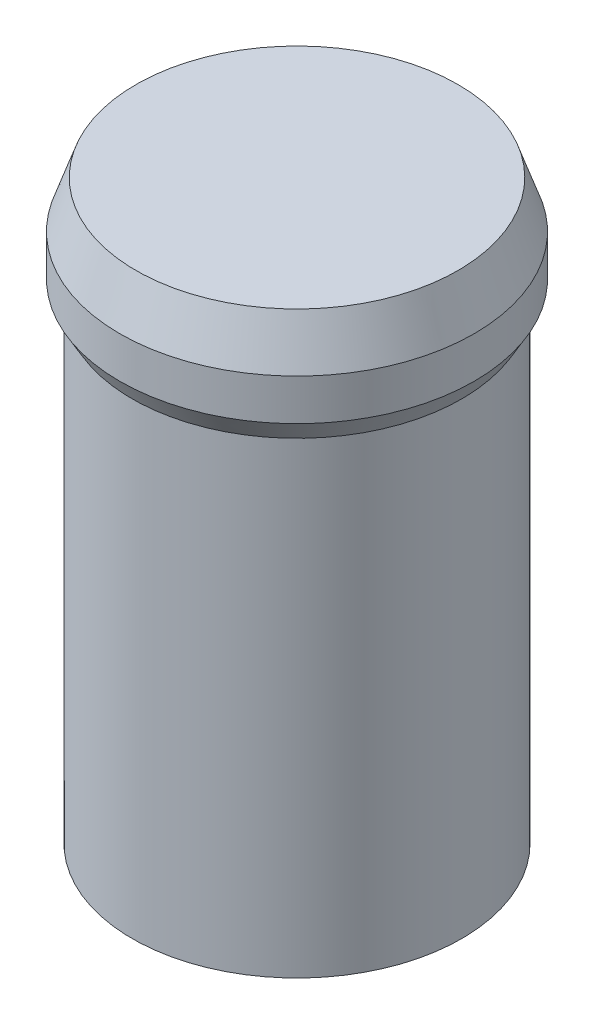
ISO-10303-21;
HEADER;
FILE_DESCRIPTION(('STEP AP214'),'2;1');
FILE_NAME('part.step','',(''),(''),'','','');
FILE_SCHEMA(('AUTOMOTIVE_DESIGN { 1 0 10303 214 1 1 1 1 }'));
ENDSEC;
DATA;
#1=APPLICATION_CONTEXT('core data for automotive mechanical design processes');
#2=APPLICATION_PROTOCOL_DEFINITION('international standard','automotive_design',2000,#1);
#3=PRODUCT_CONTEXT('',#1,'mechanical');
#4=PRODUCT('Part','Part','',(#3));
#5=PRODUCT_RELATED_PRODUCT_CATEGORY('part','',(#4));
#6=PRODUCT_DEFINITION_FORMATION('','',#4);
#7=PRODUCT_DEFINITION_CONTEXT('part definition',#1,'design');
#8=PRODUCT_DEFINITION('design','',#6,#7);
#9=PRODUCT_DEFINITION_SHAPE('','',#8);
#10=(LENGTH_UNIT() NAMED_UNIT(*) SI_UNIT(.MILLI.,.METRE.));
#11=(NAMED_UNIT(*) PLANE_ANGLE_UNIT() SI_UNIT($,.RADIAN.));
#12=(NAMED_UNIT(*) SI_UNIT($,.STERADIAN.) SOLID_ANGLE_UNIT());
#13=UNCERTAINTY_MEASURE_WITH_UNIT(LENGTH_MEASURE(1.E-05),#10,'distance_accuracy_value','');
#14=(GEOMETRIC_REPRESENTATION_CONTEXT(3) GLOBAL_UNCERTAINTY_ASSIGNED_CONTEXT((#13)) GLOBAL_UNIT_ASSIGNED_CONTEXT((#10,
#11,#12)) REPRESENTATION_CONTEXT('',''));
#15=CARTESIAN_POINT('',(0.,0.,0.));
#16=DIRECTION('',(0.,0.,1.));
#17=DIRECTION('',(1.,0.,0.));
#18=AXIS2_PLACEMENT_3D('',#15,#16,#17);
#19=CARTESIAN_POINT('',(20.,0.,0.));
#20=DIRECTION('',(0.,-1.,0.));
#21=DIRECTION('',(0.,0.,-1.));
#22=AXIS2_PLACEMENT_3D('',#19,#20,#21);
#23=PLANE('',#22);
#24=CARTESIAN_POINT('',(0.,0.,0.));
#25=DIRECTION('',(0.,-1.,0.));
#26=DIRECTION('',(0.,0.,-1.));
#27=AXIS2_PLACEMENT_3D('',#24,#25,#26);
#28=CIRCLE('',#27,20.);
#29=CARTESIAN_POINT('',(0.,0.,-20.));
#30=VERTEX_POINT('',#29);
#31=EDGE_CURVE('E62',#30,#30,#28,.T.);
#32=ORIENTED_EDGE('',*,*,#31,.T.);
#33=EDGE_LOOP('',(#32));
#34=FACE_BOUND('',#33,.T.);
#35=CARTESIAN_POINT('',(0.,0.,0.));
#36=DIRECTION('',(0.,-1.,0.));
#37=DIRECTION('',(0.,0.,-1.));
#38=AXIS2_PLACEMENT_3D('',#35,#36,#37);
#39=CIRCLE('',#38,19.);
#40=CARTESIAN_POINT('',(0.,0.,-19.));
#41=VERTEX_POINT('',#40);
#42=EDGE_CURVE('E10',#41,#41,#39,.T.);
#43=ORIENTED_EDGE('',*,*,#42,.F.);
#44=EDGE_LOOP('',(#43));
#45=FACE_BOUND('',#44,.T.);
#46=ADVANCED_FACE('F31',(#34,#45),#23,.T.);
#47=CARTESIAN_POINT('',(0.,2.4,0.));
#48=DIRECTION('',(0.,-1.,0.));
#49=DIRECTION('',(0.,0.,-1.));
#50=AXIS2_PLACEMENT_3D('',#47,#48,#49);
#51=CYLINDRICAL_SURFACE('',#50,19.);
#52=ORIENTED_EDGE('',*,*,#42,.T.);
#53=EDGE_LOOP('',(#52));
#54=FACE_BOUND('',#53,.T.);
#55=CARTESIAN_POINT('',(0.,1.15,0.));
#56=DIRECTION('',(0.,-1.,0.));
#57=DIRECTION('',(0.,0.,-1.));
#58=AXIS2_PLACEMENT_3D('',#55,#56,#57);
#59=CIRCLE('',#58,19.);
#60=CARTESIAN_POINT('',(0.,1.15,-19.));
#61=VERTEX_POINT('',#60);
#62=EDGE_CURVE('E37',#61,#61,#59,.T.);
#63=ORIENTED_EDGE('',*,*,#62,.F.);
#64=EDGE_LOOP('',(#63));
#65=FACE_BOUND('',#64,.T.);
#66=ADVANCED_FACE('F80',(#54,#65),#51,.F.);
#67=CARTESIAN_POINT('',(6.7,1.15,0.));
#68=DIRECTION('',(0.,-1.,0.));
#69=DIRECTION('',(0.,0.,-1.));
#70=AXIS2_PLACEMENT_3D('',#67,#68,#69);
#71=PLANE('',#70);
#72=ORIENTED_EDGE('',*,*,#62,.T.);
#73=EDGE_LOOP('',(#72));
#74=FACE_BOUND('',#73,.T.);
#75=CARTESIAN_POINT('',(0.,1.15,0.));
#76=DIRECTION('',(0.,-1.,0.));
#77=DIRECTION('',(0.,0.,-1.));
#78=AXIS2_PLACEMENT_3D('',#75,#76,#77);
#79=CIRCLE('',#78,6.7);
#80=CARTESIAN_POINT('',(0.,1.15,-6.7));
#81=VERTEX_POINT('',#80);
#82=EDGE_CURVE('E41',#81,#81,#79,.T.);
#83=ORIENTED_EDGE('',*,*,#82,.F.);
#84=EDGE_LOOP('',(#83));
#85=FACE_BOUND('',#84,.T.);
#86=ADVANCED_FACE('F84',(#74,#85),#71,.T.);
#87=CARTESIAN_POINT('',(0.,2.4,0.));
#88=DIRECTION('',(0.,-1.,0.));
#89=DIRECTION('',(0.,0.,-1.));
#90=AXIS2_PLACEMENT_3D('',#87,#88,#89);
#91=CYLINDRICAL_SURFACE('',#90,6.7);
#92=ORIENTED_EDGE('',*,*,#82,.T.);
#93=EDGE_LOOP('',(#92));
#94=FACE_BOUND('',#93,.T.);
#95=CARTESIAN_POINT('',(0.,2.4,0.));
#96=DIRECTION('',(0.,-1.,0.));
#97=DIRECTION('',(0.,0.,-1.));
#98=AXIS2_PLACEMENT_3D('',#95,#96,#97);
#99=CIRCLE('',#98,6.7);
#100=CARTESIAN_POINT('',(0.,2.4,-6.7));
#101=VERTEX_POINT('',#100);
#102=EDGE_CURVE('E45',#101,#101,#99,.T.);
#103=ORIENTED_EDGE('',*,*,#102,.F.);
#104=EDGE_LOOP('',(#103));
#105=FACE_BOUND('',#104,.T.);
#106=ADVANCED_FACE('F88',(#94,#105),#91,.F.);
#107=CARTESIAN_POINT('',(6.7,2.4,0.));
#108=DIRECTION('',(0.,-1.,0.));
#109=DIRECTION('',(0.,0.,-1.));
#110=AXIS2_PLACEMENT_3D('',#107,#108,#109);
#111=PLANE('',#110);
#112=ORIENTED_EDGE('',*,*,#102,.T.);
#113=EDGE_LOOP('',(#112));
#114=FACE_BOUND('',#113,.T.);
#115=ADVANCED_FACE('F94',(#114),#111,.T.);
#116=CARTESIAN_POINT('',(19.5472629066576,69.9985359070053,0.));
#117=DIRECTION('',(0.,1.,0.));
#118=DIRECTION('',(0.,0.,1.));
#119=AXIS2_PLACEMENT_3D('',#116,#117,#118);
#120=PLANE('',#119);
#121=CARTESIAN_POINT('',(0.,69.9985359070053,0.));
#122=DIRECTION('',(0.,-1.,0.));
#123=DIRECTION('',(0.,0.,-1.));
#124=AXIS2_PLACEMENT_3D('',#121,#122,#123);
#125=CIRCLE('',#124,19.5472629066576);
#126=CARTESIAN_POINT('',(0.,69.9985359070053,-19.5472629066576));
#127=VERTEX_POINT('',#126);
#128=EDGE_CURVE('E50',#127,#127,#125,.T.);
#129=ORIENTED_EDGE('',*,*,#128,.F.);
#130=EDGE_LOOP('',(#129));
#131=FACE_BOUND('',#130,.T.);
#132=ADVANCED_FACE('F98',(#131),#120,.T.);
#133=CARTESIAN_POINT('',(0.,64.3251931671134,0.));
#134=DIRECTION('',(0.,-1.,0.));
#135=DIRECTION('',(0.,0.,-1.));
#136=AXIS2_PLACEMENT_3D('',#133,#134,#135);
#137=CONICAL_SURFACE('',#136,21.5,0.331494136143233);
#138=ORIENTED_EDGE('',*,*,#128,.T.);
#139=EDGE_LOOP('',(#138));
#140=FACE_BOUND('',#139,.T.);
#141=CARTESIAN_POINT('',(0.,64.3251931671134,0.));
#142=DIRECTION('',(0.,-1.,0.));
#143=DIRECTION('',(0.,0.,-1.));
#144=AXIS2_PLACEMENT_3D('',#141,#142,#143);
#145=CIRCLE('',#144,21.5);
#146=CARTESIAN_POINT('',(0.,64.3251931671134,-21.5));
#147=VERTEX_POINT('',#146);
#148=EDGE_CURVE('E53',#147,#147,#145,.T.);
#149=ORIENTED_EDGE('',*,*,#148,.F.);
#150=EDGE_LOOP('',(#149));
#151=FACE_BOUND('',#150,.T.);
#152=ADVANCED_FACE('F102',(#140,#151),#137,.T.);
#153=CARTESIAN_POINT('',(0.,2.4,0.));
#154=DIRECTION('',(0.,-1.,0.));
#155=DIRECTION('',(0.,0.,-1.));
#156=AXIS2_PLACEMENT_3D('',#153,#154,#155);
#157=CYLINDRICAL_SURFACE('',#156,21.5);
#158=ORIENTED_EDGE('',*,*,#148,.T.);
#159=EDGE_LOOP('',(#158));
#160=FACE_BOUND('',#159,.T.);
#161=CARTESIAN_POINT('',(0.,59.3251931671134,0.));
#162=DIRECTION('',(0.,-1.,0.));
#163=DIRECTION('',(0.,0.,-1.));
#164=AXIS2_PLACEMENT_3D('',#161,#162,#163);
#165=CIRCLE('',#164,21.5);
#166=CARTESIAN_POINT('',(0.,59.3251931671134,-21.5));
#167=VERTEX_POINT('',#166);
#168=EDGE_CURVE('E56',#167,#167,#165,.T.);
#169=ORIENTED_EDGE('',*,*,#168,.F.);
#170=EDGE_LOOP('',(#169));
#171=FACE_BOUND('',#170,.T.);
#172=ADVANCED_FACE('F76',(#160,#171),#157,.T.);
#173=CARTESIAN_POINT('',(0.,56.7271169557601,0.));
#174=DIRECTION('',(0.,1.,0.));
#175=DIRECTION('',(0.,0.,1.));
#176=AXIS2_PLACEMENT_3D('',#173,#174,#175);
#177=CONICAL_SURFACE('',#176,20.,0.523598775598301);
#178=ORIENTED_EDGE('',*,*,#168,.T.);
#179=EDGE_LOOP('',(#178));
#180=FACE_BOUND('',#179,.T.);
#181=CARTESIAN_POINT('',(0.,56.7271169557601,0.));
#182=DIRECTION('',(0.,-1.,0.));
#183=DIRECTION('',(0.,0.,-1.));
#184=AXIS2_PLACEMENT_3D('',#181,#182,#183);
#185=CIRCLE('',#184,20.);
#186=CARTESIAN_POINT('',(0.,56.7271169557601,-20.));
#187=VERTEX_POINT('',#186);
#188=EDGE_CURVE('E59',#187,#187,#185,.T.);
#189=ORIENTED_EDGE('',*,*,#188,.F.);
#190=EDGE_LOOP('',(#189));
#191=FACE_BOUND('',#190,.T.);
#192=ADVANCED_FACE('F70',(#180,#191),#177,.T.);
#193=CARTESIAN_POINT('',(0.,2.4,0.));
#194=DIRECTION('',(0.,-1.,0.));
#195=DIRECTION('',(0.,0.,-1.));
#196=AXIS2_PLACEMENT_3D('',#193,#194,#195);
#197=CYLINDRICAL_SURFACE('',#196,20.);
#198=ORIENTED_EDGE('',*,*,#188,.T.);
#199=EDGE_LOOP('',(#198));
#200=FACE_BOUND('',#199,.T.);
#201=ORIENTED_EDGE('',*,*,#31,.F.);
#202=EDGE_LOOP('',(#201));
#203=FACE_BOUND('',#202,.T.);
#204=ADVANCED_FACE('F68',(#200,#203),#197,.T.);
#205=CLOSED_SHELL('',(#46,#66,#86,#106,#115,#132,#152,#172,#192,#204));
#206=MANIFOLD_SOLID_BREP('B2',#205);
#207=ADVANCED_BREP_SHAPE_REPRESENTATION('',(#18,#206),#14);
#208=SHAPE_DEFINITION_REPRESENTATION(#9,#207);
ENDSEC;
END-ISO-10303-21;
